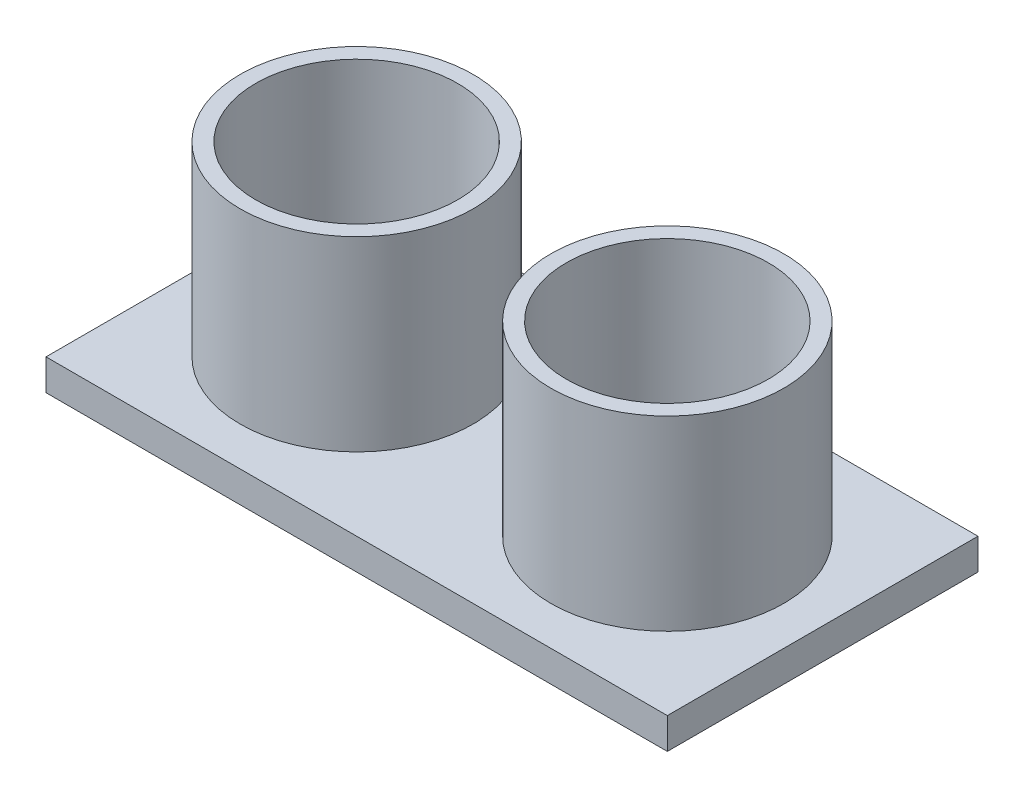
ISO-10303-21;
HEADER;
FILE_DESCRIPTION(('STEP AP214'),'2;1');
FILE_NAME('part.step','',(''),(''),'','','');
FILE_SCHEMA(('AUTOMOTIVE_DESIGN { 1 0 10303 214 1 1 1 1 }'));
ENDSEC;
DATA;
#1=APPLICATION_CONTEXT('core data for automotive mechanical design processes');
#2=APPLICATION_PROTOCOL_DEFINITION('international standard','automotive_design',2000,#1);
#3=PRODUCT_CONTEXT('',#1,'mechanical');
#4=PRODUCT('Part','Part','',(#3));
#5=PRODUCT_RELATED_PRODUCT_CATEGORY('part','',(#4));
#6=PRODUCT_DEFINITION_FORMATION('','',#4);
#7=PRODUCT_DEFINITION_CONTEXT('part definition',#1,'design');
#8=PRODUCT_DEFINITION('design','',#6,#7);
#9=PRODUCT_DEFINITION_SHAPE('','',#8);
#10=(LENGTH_UNIT() NAMED_UNIT(*) SI_UNIT(.MILLI.,.METRE.));
#11=(NAMED_UNIT(*) PLANE_ANGLE_UNIT() SI_UNIT($,.RADIAN.));
#12=(NAMED_UNIT(*) SI_UNIT($,.STERADIAN.) SOLID_ANGLE_UNIT());
#13=UNCERTAINTY_MEASURE_WITH_UNIT(LENGTH_MEASURE(1.E-05),#10,'distance_accuracy_value','');
#14=(GEOMETRIC_REPRESENTATION_CONTEXT(3) GLOBAL_UNCERTAINTY_ASSIGNED_CONTEXT((#13)) GLOBAL_UNIT_ASSIGNED_CONTEXT((#10,
#11,#12)) REPRESENTATION_CONTEXT('',''));
#15=CARTESIAN_POINT('',(0.,0.,0.));
#16=DIRECTION('',(0.,0.,1.));
#17=DIRECTION('',(1.,0.,0.));
#18=AXIS2_PLACEMENT_3D('',#15,#16,#17);
#19=CARTESIAN_POINT('',(0.,2.,0.));
#20=DIRECTION('',(0.,1.,0.));
#21=DIRECTION('',(0.,0.,1.));
#22=AXIS2_PLACEMENT_3D('',#19,#20,#21);
#23=PLANE('',#22);
#24=CARTESIAN_POINT('',(10.,2.,0.));
#25=DIRECTION('',(0.,1.,0.));
#26=DIRECTION('',(0.,0.,1.));
#27=AXIS2_PLACEMENT_3D('',#24,#25,#26);
#28=CIRCLE('',#27,7.5);
#29=CARTESIAN_POINT('',(10.,2.,7.5));
#30=VERTEX_POINT('',#29);
#31=EDGE_CURVE('E162',#30,#30,#28,.T.);
#32=ORIENTED_EDGE('',*,*,#31,.F.);
#33=EDGE_LOOP('',(#32));
#34=FACE_BOUND('',#33,.T.);
#35=CARTESIAN_POINT('',(-10.,2.,0.));
#36=DIRECTION('',(0.,1.,0.));
#37=DIRECTION('',(0.,0.,1.));
#38=AXIS2_PLACEMENT_3D('',#35,#36,#37);
#39=CIRCLE('',#38,7.5);
#40=CARTESIAN_POINT('',(-10.,2.,7.5));
#41=VERTEX_POINT('',#40);
#42=EDGE_CURVE('E170',#41,#41,#39,.T.);
#43=ORIENTED_EDGE('',*,*,#42,.F.);
#44=EDGE_LOOP('',(#43));
#45=FACE_BOUND('',#44,.T.);
#46=DIRECTION('',(0.,0.,-1.));
#47=VECTOR('',#46,1.);
#48=CARTESIAN_POINT('',(20.,2.,-10.));
#49=LINE('',#48,#47);
#50=CARTESIAN_POINT('',(20.,2.,10.));
#51=VERTEX_POINT('',#50);
#52=CARTESIAN_POINT('',(20.,2.,-10.));
#53=VERTEX_POINT('',#52);
#54=EDGE_CURVE('E182',#51,#53,#49,.T.);
#55=ORIENTED_EDGE('',*,*,#54,.T.);
#56=DIRECTION('',(-1.,0.,0.));
#57=VECTOR('',#56,1.);
#58=CARTESIAN_POINT('',(-20.,2.,-10.));
#59=LINE('',#58,#57);
#60=CARTESIAN_POINT('',(-20.,2.,-10.));
#61=VERTEX_POINT('',#60);
#62=EDGE_CURVE('E94',#53,#61,#59,.T.);
#63=ORIENTED_EDGE('',*,*,#62,.T.);
#64=DIRECTION('',(0.,0.,1.));
#65=VECTOR('',#64,1.);
#66=CARTESIAN_POINT('',(-20.,2.,-10.));
#67=LINE('',#66,#65);
#68=CARTESIAN_POINT('',(-20.,2.,10.));
#69=VERTEX_POINT('',#68);
#70=EDGE_CURVE('E187',#61,#69,#67,.T.);
#71=ORIENTED_EDGE('',*,*,#70,.T.);
#72=DIRECTION('',(1.,0.,0.));
#73=VECTOR('',#72,1.);
#74=CARTESIAN_POINT('',(-20.,2.,10.));
#75=LINE('',#74,#73);
#76=EDGE_CURVE('E66',#69,#51,#75,.T.);
#77=ORIENTED_EDGE('',*,*,#76,.T.);
#78=EDGE_LOOP('',(#55,#63,#71,#77));
#79=FACE_BOUND('',#78,.T.);
#80=DIRECTION('',(1.,0.,0.));
#81=VECTOR('',#80,1.);
#82=CARTESIAN_POINT('',(-3.,2.,-6.));
#83=LINE('',#82,#81);
#84=CARTESIAN_POINT('',(-3.,2.,-6.));
#85=VERTEX_POINT('',#84);
#86=CARTESIAN_POINT('',(3.,2.,-6.));
#87=VERTEX_POINT('',#86);
#88=EDGE_CURVE('E406',#85,#87,#83,.T.);
#89=ORIENTED_EDGE('',*,*,#88,.F.);
#90=CARTESIAN_POINT('',(-3.,2.,-7.5));
#91=DIRECTION('',(0.,1.,0.));
#92=DIRECTION('',(0.,0.,1.));
#93=AXIS2_PLACEMENT_3D('',#90,#91,#92);
#94=CIRCLE('',#93,1.5);
#95=CARTESIAN_POINT('',(-3.,2.,-9.));
#96=VERTEX_POINT('',#95);
#97=EDGE_CURVE('E141',#96,#85,#94,.T.);
#98=ORIENTED_EDGE('',*,*,#97,.F.);
#99=DIRECTION('',(-1.,0.,0.));
#100=VECTOR('',#99,1.);
#101=CARTESIAN_POINT('',(-3.,2.,-9.));
#102=LINE('',#101,#100);
#103=CARTESIAN_POINT('',(3.,2.,-9.));
#104=VERTEX_POINT('',#103);
#105=EDGE_CURVE('E137',#104,#96,#102,.T.);
#106=ORIENTED_EDGE('',*,*,#105,.F.);
#107=CARTESIAN_POINT('',(3.,2.,-7.5));
#108=DIRECTION('',(0.,1.,0.));
#109=DIRECTION('',(0.,0.,-1.));
#110=AXIS2_PLACEMENT_3D('',#107,#108,#109);
#111=CIRCLE('',#110,1.5);
#112=EDGE_CURVE('E402',#87,#104,#111,.T.);
#113=ORIENTED_EDGE('',*,*,#112,.F.);
#114=EDGE_LOOP('',(#89,#98,#106,#113));
#115=FACE_BOUND('',#114,.T.);
#116=ADVANCED_FACE('F41',(#34,#45,#79,#115),#23,.T.);
#117=CARTESIAN_POINT('',(20.,2.,-10.));
#118=DIRECTION('',(-1.,0.,0.));
#119=DIRECTION('',(0.,0.,1.));
#120=AXIS2_PLACEMENT_3D('',#117,#118,#119);
#121=PLANE('',#120);
#122=DIRECTION('',(0.,0.,-1.));
#123=VECTOR('',#122,1.);
#124=CARTESIAN_POINT('',(20.,0.,-10.));
#125=LINE('',#124,#123);
#126=CARTESIAN_POINT('',(20.,0.,10.));
#127=VERTEX_POINT('',#126);
#128=CARTESIAN_POINT('',(20.,0.,-10.));
#129=VERTEX_POINT('',#128);
#130=EDGE_CURVE('E178',#127,#129,#125,.T.);
#131=ORIENTED_EDGE('',*,*,#130,.T.);
#132=DIRECTION('',(0.,-1.,0.));
#133=VECTOR('',#132,1.);
#134=CARTESIAN_POINT('',(20.,2.,-10.));
#135=LINE('',#134,#133);
#136=EDGE_CURVE('E11',#53,#129,#135,.T.);
#137=ORIENTED_EDGE('',*,*,#136,.F.);
#138=ORIENTED_EDGE('',*,*,#54,.F.);
#139=DIRECTION('',(0.,-1.,0.));
#140=VECTOR('',#139,1.);
#141=CARTESIAN_POINT('',(20.,2.,10.));
#142=LINE('',#141,#140);
#143=EDGE_CURVE('E192',#51,#127,#142,.T.);
#144=ORIENTED_EDGE('',*,*,#143,.T.);
#145=EDGE_LOOP('',(#131,#137,#138,#144));
#146=FACE_BOUND('',#145,.T.);
#147=ADVANCED_FACE('F43',(#146),#121,.F.);
#148=CARTESIAN_POINT('',(-20.,2.,-10.));
#149=DIRECTION('',(0.,0.,1.));
#150=DIRECTION('',(1.,0.,0.));
#151=AXIS2_PLACEMENT_3D('',#148,#149,#150);
#152=PLANE('',#151);
#153=DIRECTION('',(-1.,0.,0.));
#154=VECTOR('',#153,1.);
#155=CARTESIAN_POINT('',(-20.,0.,-10.));
#156=LINE('',#155,#154);
#157=CARTESIAN_POINT('',(-20.,0.,-10.));
#158=VERTEX_POINT('',#157);
#159=EDGE_CURVE('E196',#129,#158,#156,.T.);
#160=ORIENTED_EDGE('',*,*,#159,.T.);
#161=DIRECTION('',(0.,-1.,0.));
#162=VECTOR('',#161,1.);
#163=CARTESIAN_POINT('',(-20.,2.,-10.));
#164=LINE('',#163,#162);
#165=EDGE_CURVE('E50',#61,#158,#164,.T.);
#166=ORIENTED_EDGE('',*,*,#165,.F.);
#167=ORIENTED_EDGE('',*,*,#62,.F.);
#168=ORIENTED_EDGE('',*,*,#136,.T.);
#169=EDGE_LOOP('',(#160,#166,#167,#168));
#170=FACE_BOUND('',#169,.T.);
#171=ADVANCED_FACE('F230',(#170),#152,.F.);
#172=CARTESIAN_POINT('',(-20.,2.,-10.));
#173=DIRECTION('',(1.,0.,0.));
#174=DIRECTION('',(0.,0.,-1.));
#175=AXIS2_PLACEMENT_3D('',#172,#173,#174);
#176=PLANE('',#175);
#177=DIRECTION('',(0.,0.,1.));
#178=VECTOR('',#177,1.);
#179=CARTESIAN_POINT('',(-20.,0.,-10.));
#180=LINE('',#179,#178);
#181=CARTESIAN_POINT('',(-20.,0.,10.));
#182=VERTEX_POINT('',#181);
#183=EDGE_CURVE('E199',#158,#182,#180,.T.);
#184=ORIENTED_EDGE('',*,*,#183,.T.);
#185=DIRECTION('',(0.,-1.,0.));
#186=VECTOR('',#185,1.);
#187=CARTESIAN_POINT('',(-20.,2.,10.));
#188=LINE('',#187,#186);
#189=EDGE_CURVE('E206',#69,#182,#188,.T.);
#190=ORIENTED_EDGE('',*,*,#189,.F.);
#191=ORIENTED_EDGE('',*,*,#70,.F.);
#192=ORIENTED_EDGE('',*,*,#165,.T.);
#193=EDGE_LOOP('',(#184,#190,#191,#192));
#194=FACE_BOUND('',#193,.T.);
#195=ADVANCED_FACE('F213',(#194),#176,.F.);
#196=CARTESIAN_POINT('',(-20.,2.,10.));
#197=DIRECTION('',(0.,0.,-1.));
#198=DIRECTION('',(-1.,0.,0.));
#199=AXIS2_PLACEMENT_3D('',#196,#197,#198);
#200=PLANE('',#199);
#201=DIRECTION('',(1.,0.,0.));
#202=VECTOR('',#201,1.);
#203=CARTESIAN_POINT('',(-20.,0.,10.));
#204=LINE('',#203,#202);
#205=EDGE_CURVE('E87',#182,#127,#204,.T.);
#206=ORIENTED_EDGE('',*,*,#205,.T.);
#207=ORIENTED_EDGE('',*,*,#143,.F.);
#208=ORIENTED_EDGE('',*,*,#76,.F.);
#209=ORIENTED_EDGE('',*,*,#189,.T.);
#210=EDGE_LOOP('',(#206,#207,#208,#209));
#211=FACE_BOUND('',#210,.T.);
#212=ADVANCED_FACE('F221',(#211),#200,.F.);
#213=CARTESIAN_POINT('',(0.,0.,0.));
#214=DIRECTION('',(0.,1.,0.));
#215=DIRECTION('',(0.,0.,1.));
#216=AXIS2_PLACEMENT_3D('',#213,#214,#215);
#217=PLANE('',#216);
#218=ORIENTED_EDGE('',*,*,#130,.F.);
#219=ORIENTED_EDGE('',*,*,#205,.F.);
#220=ORIENTED_EDGE('',*,*,#183,.F.);
#221=ORIENTED_EDGE('',*,*,#159,.F.);
#222=EDGE_LOOP('',(#218,#219,#220,#221));
#223=FACE_BOUND('',#222,.T.);
#224=ADVANCED_FACE('F217',(#223),#217,.F.);
#225=CARTESIAN_POINT('',(-10.,14.,0.));
#226=DIRECTION('',(0.,-1.,0.));
#227=DIRECTION('',(0.,0.,-1.));
#228=AXIS2_PLACEMENT_3D('',#225,#226,#227);
#229=CYLINDRICAL_SURFACE('',#228,7.5);
#230=CARTESIAN_POINT('',(-10.,14.,0.));
#231=DIRECTION('',(0.,1.,0.));
#232=DIRECTION('',(0.,0.,1.));
#233=AXIS2_PLACEMENT_3D('',#230,#231,#232);
#234=CIRCLE('',#233,7.5);
#235=CARTESIAN_POINT('',(-10.,14.,7.5));
#236=VERTEX_POINT('',#235);
#237=EDGE_CURVE('E174',#236,#236,#234,.T.);
#238=ORIENTED_EDGE('',*,*,#237,.F.);
#239=EDGE_LOOP('',(#238));
#240=FACE_BOUND('',#239,.T.);
#241=ORIENTED_EDGE('',*,*,#42,.T.);
#242=EDGE_LOOP('',(#241));
#243=FACE_BOUND('',#242,.T.);
#244=ADVANCED_FACE('F228',(#240,#243),#229,.T.);
#245=CARTESIAN_POINT('',(-10.,14.,0.));
#246=DIRECTION('',(0.,1.,0.));
#247=DIRECTION('',(0.,0.,1.));
#248=AXIS2_PLACEMENT_3D('',#245,#246,#247);
#249=PLANE('',#248);
#250=CARTESIAN_POINT('',(-10.,14.,0.));
#251=DIRECTION('',(0.,1.,0.));
#252=DIRECTION('',(0.,0.,1.));
#253=AXIS2_PLACEMENT_3D('',#250,#251,#252);
#254=CIRCLE('',#253,6.5);
#255=CARTESIAN_POINT('',(-10.,14.,6.5));
#256=VERTEX_POINT('',#255);
#257=EDGE_CURVE('E156',#256,#256,#254,.T.);
#258=ORIENTED_EDGE('',*,*,#257,.F.);
#259=EDGE_LOOP('',(#258));
#260=FACE_BOUND('',#259,.T.);
#261=ORIENTED_EDGE('',*,*,#237,.T.);
#262=EDGE_LOOP('',(#261));
#263=FACE_BOUND('',#262,.T.);
#264=ADVANCED_FACE('F243',(#260,#263),#249,.T.);
#265=CARTESIAN_POINT('',(10.,14.,0.));
#266=DIRECTION('',(0.,-1.,0.));
#267=DIRECTION('',(0.,0.,-1.));
#268=AXIS2_PLACEMENT_3D('',#265,#266,#267);
#269=CYLINDRICAL_SURFACE('',#268,7.5);
#270=CARTESIAN_POINT('',(10.,14.,0.));
#271=DIRECTION('',(0.,1.,0.));
#272=DIRECTION('',(0.,0.,1.));
#273=AXIS2_PLACEMENT_3D('',#270,#271,#272);
#274=CIRCLE('',#273,7.5);
#275=CARTESIAN_POINT('',(10.,14.,7.5));
#276=VERTEX_POINT('',#275);
#277=EDGE_CURVE('E166',#276,#276,#274,.T.);
#278=ORIENTED_EDGE('',*,*,#277,.F.);
#279=EDGE_LOOP('',(#278));
#280=FACE_BOUND('',#279,.T.);
#281=ORIENTED_EDGE('',*,*,#31,.T.);
#282=EDGE_LOOP('',(#281));
#283=FACE_BOUND('',#282,.T.);
#284=ADVANCED_FACE('F247',(#280,#283),#269,.T.);
#285=CARTESIAN_POINT('',(10.,14.,0.));
#286=DIRECTION('',(0.,1.,0.));
#287=DIRECTION('',(0.,0.,1.));
#288=AXIS2_PLACEMENT_3D('',#285,#286,#287);
#289=PLANE('',#288);
#290=CARTESIAN_POINT('',(10.,14.,0.));
#291=DIRECTION('',(0.,1.,0.));
#292=DIRECTION('',(0.,0.,1.));
#293=AXIS2_PLACEMENT_3D('',#290,#291,#292);
#294=CIRCLE('',#293,6.5);
#295=CARTESIAN_POINT('',(10.,14.,6.5));
#296=VERTEX_POINT('',#295);
#297=EDGE_CURVE('E144',#296,#296,#294,.T.);
#298=ORIENTED_EDGE('',*,*,#297,.F.);
#299=EDGE_LOOP('',(#298));
#300=FACE_BOUND('',#299,.T.);
#301=ORIENTED_EDGE('',*,*,#277,.T.);
#302=EDGE_LOOP('',(#301));
#303=FACE_BOUND('',#302,.T.);
#304=ADVANCED_FACE('F251',(#300,#303),#289,.T.);
#305=CARTESIAN_POINT('',(-10.,2.,0.));
#306=DIRECTION('',(0.,1.,0.));
#307=DIRECTION('',(0.,0.,1.));
#308=AXIS2_PLACEMENT_3D('',#305,#306,#307);
#309=CYLINDRICAL_SURFACE('',#308,6.5);
#310=CARTESIAN_POINT('',(-10.,2.,0.));
#311=DIRECTION('',(0.,1.,0.));
#312=DIRECTION('',(0.,0.,1.));
#313=AXIS2_PLACEMENT_3D('',#310,#311,#312);
#314=CIRCLE('',#313,6.5);
#315=CARTESIAN_POINT('',(-10.,2.,6.5));
#316=VERTEX_POINT('',#315);
#317=EDGE_CURVE('E158',#316,#316,#314,.T.);
#318=ORIENTED_EDGE('',*,*,#317,.F.);
#319=EDGE_LOOP('',(#318));
#320=FACE_BOUND('',#319,.T.);
#321=ORIENTED_EDGE('',*,*,#257,.T.);
#322=EDGE_LOOP('',(#321));
#323=FACE_BOUND('',#322,.T.);
#324=ADVANCED_FACE('F255',(#320,#323),#309,.F.);
#325=CARTESIAN_POINT('',(-10.,2.,0.));
#326=DIRECTION('',(0.,1.,0.));
#327=DIRECTION('',(0.,0.,1.));
#328=AXIS2_PLACEMENT_3D('',#325,#326,#327);
#329=PLANE('',#328);
#330=ORIENTED_EDGE('',*,*,#317,.T.);
#331=EDGE_LOOP('',(#330));
#332=FACE_BOUND('',#331,.T.);
#333=ADVANCED_FACE('F259',(#332),#329,.T.);
#334=CARTESIAN_POINT('',(10.,2.,0.));
#335=DIRECTION('',(0.,1.,0.));
#336=DIRECTION('',(0.,0.,1.));
#337=AXIS2_PLACEMENT_3D('',#334,#335,#336);
#338=CYLINDRICAL_SURFACE('',#337,6.5);
#339=CARTESIAN_POINT('',(10.,2.,0.));
#340=DIRECTION('',(0.,1.,0.));
#341=DIRECTION('',(0.,0.,1.));
#342=AXIS2_PLACEMENT_3D('',#339,#340,#341);
#343=CIRCLE('',#342,6.5);
#344=CARTESIAN_POINT('',(10.,2.,6.5));
#345=VERTEX_POINT('',#344);
#346=EDGE_CURVE('E149',#345,#345,#343,.T.);
#347=ORIENTED_EDGE('',*,*,#346,.F.);
#348=EDGE_LOOP('',(#347));
#349=FACE_BOUND('',#348,.T.);
#350=ORIENTED_EDGE('',*,*,#297,.T.);
#351=EDGE_LOOP('',(#350));
#352=FACE_BOUND('',#351,.T.);
#353=ADVANCED_FACE('F263',(#349,#352),#338,.F.);
#354=CARTESIAN_POINT('',(10.,2.,0.));
#355=DIRECTION('',(0.,1.,0.));
#356=DIRECTION('',(0.,0.,1.));
#357=AXIS2_PLACEMENT_3D('',#354,#355,#356);
#358=PLANE('',#357);
#359=ORIENTED_EDGE('',*,*,#346,.T.);
#360=EDGE_LOOP('',(#359));
#361=FACE_BOUND('',#360,.T.);
#362=ADVANCED_FACE('F267',(#361),#358,.T.);
#363=CARTESIAN_POINT('',(-3.,4.,-7.5));
#364=DIRECTION('',(0.,-1.,0.));
#365=DIRECTION('',(0.,0.,-1.));
#366=AXIS2_PLACEMENT_3D('',#363,#364,#365);
#367=CYLINDRICAL_SURFACE('',#366,1.5);
#368=ORIENTED_EDGE('',*,*,#97,.T.);
#369=DIRECTION('',(0.,-1.,0.));
#370=VECTOR('',#369,1.);
#371=CARTESIAN_POINT('',(-3.,4.,-6.));
#372=LINE('',#371,#370);
#373=CARTESIAN_POINT('',(-3.,4.,-6.));
#374=VERTEX_POINT('',#373);
#375=EDGE_CURVE('E120',#374,#85,#372,.T.);
#376=ORIENTED_EDGE('',*,*,#375,.F.);
#377=CARTESIAN_POINT('',(-3.,4.,-7.5));
#378=DIRECTION('',(0.,1.,0.));
#379=DIRECTION('',(0.,0.,1.));
#380=AXIS2_PLACEMENT_3D('',#377,#378,#379);
#381=CIRCLE('',#380,1.5);
#382=CARTESIAN_POINT('',(-3.,4.,-9.));
#383=VERTEX_POINT('',#382);
#384=EDGE_CURVE('E128',#383,#374,#381,.T.);
#385=ORIENTED_EDGE('',*,*,#384,.F.);
#386=DIRECTION('',(0.,-1.,0.));
#387=VECTOR('',#386,1.);
#388=CARTESIAN_POINT('',(-3.,4.,-9.));
#389=LINE('',#388,#387);
#390=EDGE_CURVE('E398',#383,#96,#389,.T.);
#391=ORIENTED_EDGE('',*,*,#390,.T.);
#392=EDGE_LOOP('',(#368,#376,#385,#391));
#393=FACE_BOUND('',#392,.T.);
#394=ADVANCED_FACE('F139',(#393),#367,.T.);
#395=CARTESIAN_POINT('',(-3.,4.,-6.));
#396=DIRECTION('',(0.,0.,-1.));
#397=DIRECTION('',(-1.,0.,0.));
#398=AXIS2_PLACEMENT_3D('',#395,#396,#397);
#399=PLANE('',#398);
#400=ORIENTED_EDGE('',*,*,#88,.T.);
#401=DIRECTION('',(0.,-1.,0.));
#402=VECTOR('',#401,1.);
#403=CARTESIAN_POINT('',(3.,4.,-6.));
#404=LINE('',#403,#402);
#405=CARTESIAN_POINT('',(3.,4.,-6.));
#406=VERTEX_POINT('',#405);
#407=EDGE_CURVE('E123',#406,#87,#404,.T.);
#408=ORIENTED_EDGE('',*,*,#407,.F.);
#409=DIRECTION('',(1.,0.,0.));
#410=VECTOR('',#409,1.);
#411=CARTESIAN_POINT('',(-3.,4.,-6.));
#412=LINE('',#411,#410);
#413=EDGE_CURVE('E116',#374,#406,#412,.T.);
#414=ORIENTED_EDGE('',*,*,#413,.F.);
#415=ORIENTED_EDGE('',*,*,#375,.T.);
#416=EDGE_LOOP('',(#400,#408,#414,#415));
#417=FACE_BOUND('',#416,.T.);
#418=ADVANCED_FACE('F118',(#417),#399,.F.);
#419=CARTESIAN_POINT('',(3.,4.,-7.5));
#420=DIRECTION('',(0.,-1.,0.));
#421=DIRECTION('',(0.,0.,-1.));
#422=AXIS2_PLACEMENT_3D('',#419,#420,#421);
#423=CYLINDRICAL_SURFACE('',#422,1.5);
#424=ORIENTED_EDGE('',*,*,#112,.T.);
#425=DIRECTION('',(0.,-1.,0.));
#426=VECTOR('',#425,1.);
#427=CARTESIAN_POINT('',(3.,4.,-9.));
#428=LINE('',#427,#426);
#429=CARTESIAN_POINT('',(3.,4.,-9.));
#430=VERTEX_POINT('',#429);
#431=EDGE_CURVE('E57',#430,#104,#428,.T.);
#432=ORIENTED_EDGE('',*,*,#431,.F.);
#433=CARTESIAN_POINT('',(3.,4.,-7.5));
#434=DIRECTION('',(0.,1.,0.));
#435=DIRECTION('',(0.,0.,-1.));
#436=AXIS2_PLACEMENT_3D('',#433,#434,#435);
#437=CIRCLE('',#436,1.5);
#438=EDGE_CURVE('E127',#406,#430,#437,.T.);
#439=ORIENTED_EDGE('',*,*,#438,.F.);
#440=ORIENTED_EDGE('',*,*,#407,.T.);
#441=EDGE_LOOP('',(#424,#432,#439,#440));
#442=FACE_BOUND('',#441,.T.);
#443=ADVANCED_FACE('F276',(#442),#423,.T.);
#444=CARTESIAN_POINT('',(-3.,4.,-9.));
#445=DIRECTION('',(0.,0.,1.));
#446=DIRECTION('',(1.,0.,0.));
#447=AXIS2_PLACEMENT_3D('',#444,#445,#446);
#448=PLANE('',#447);
#449=ORIENTED_EDGE('',*,*,#105,.T.);
#450=ORIENTED_EDGE('',*,*,#390,.F.);
#451=DIRECTION('',(-1.,0.,0.));
#452=VECTOR('',#451,1.);
#453=CARTESIAN_POINT('',(-3.,4.,-9.));
#454=LINE('',#453,#452);
#455=EDGE_CURVE('E132',#430,#383,#454,.T.);
#456=ORIENTED_EDGE('',*,*,#455,.F.);
#457=ORIENTED_EDGE('',*,*,#431,.T.);
#458=EDGE_LOOP('',(#449,#450,#456,#457));
#459=FACE_BOUND('',#458,.T.);
#460=ADVANCED_FACE('F279',(#459),#448,.F.);
#461=CARTESIAN_POINT('',(-3.,4.,-7.5));
#462=DIRECTION('',(0.,1.,0.));
#463=DIRECTION('',(0.,0.,1.));
#464=AXIS2_PLACEMENT_3D('',#461,#462,#463);
#465=PLANE('',#464);
#466=ORIENTED_EDGE('',*,*,#384,.T.);
#467=ORIENTED_EDGE('',*,*,#413,.T.);
#468=ORIENTED_EDGE('',*,*,#438,.T.);
#469=ORIENTED_EDGE('',*,*,#455,.T.);
#470=EDGE_LOOP('',(#466,#467,#468,#469));
#471=FACE_BOUND('',#470,.T.);
#472=ADVANCED_FACE('F131',(#471),#465,.T.);
#473=CLOSED_SHELL('',(#116,#147,#171,#195,#212,#224,#244,#264,#284,#304,#324,#333,#353,#362,
#394,#418,#443,#460,#472));
#474=MANIFOLD_SOLID_BREP('B2',#473);
#475=ADVANCED_BREP_SHAPE_REPRESENTATION('',(#18,#474),#14);
#476=SHAPE_DEFINITION_REPRESENTATION(#9,#475);
ENDSEC;
END-ISO-10303-21;
